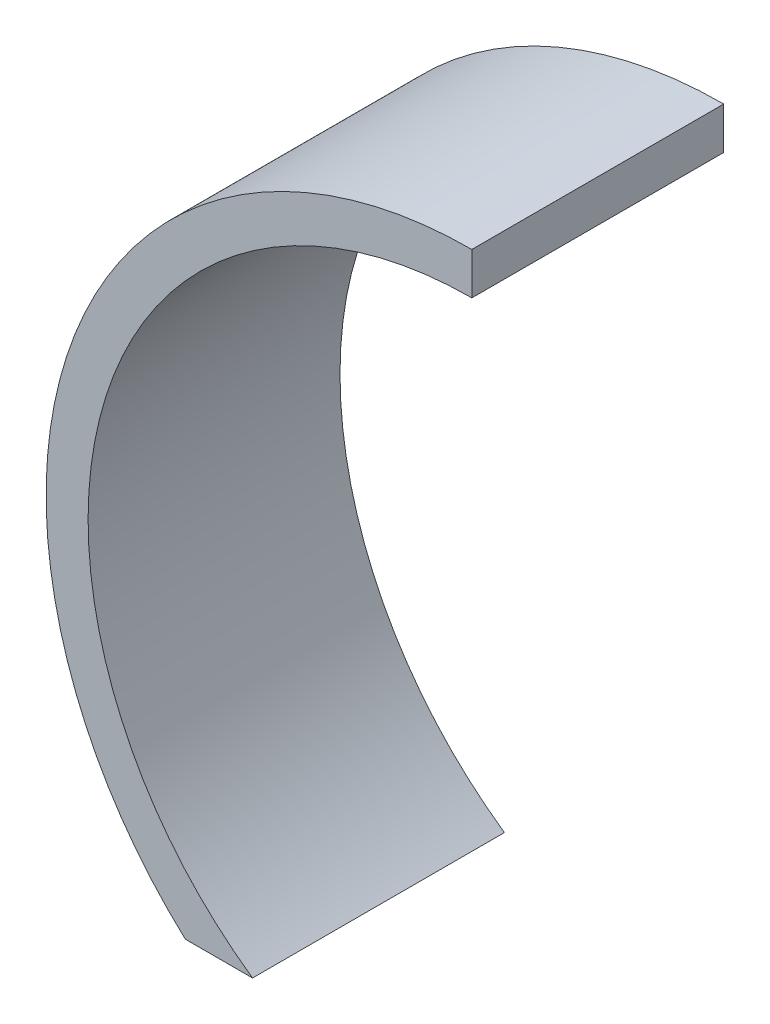
ISO-10303-21;
HEADER;
FILE_DESCRIPTION(('STEP AP214'),'2;1');
FILE_NAME('part.step','',(''),(''),'','','');
FILE_SCHEMA(('AUTOMOTIVE_DESIGN { 1 0 10303 214 1 1 1 1 }'));
ENDSEC;
DATA;
#1=APPLICATION_CONTEXT('core data for automotive mechanical design processes');
#2=APPLICATION_PROTOCOL_DEFINITION('international standard','automotive_design',2000,#1);
#3=PRODUCT_CONTEXT('',#1,'mechanical');
#4=PRODUCT('Part','Part','',(#3));
#5=PRODUCT_RELATED_PRODUCT_CATEGORY('part','',(#4));
#6=PRODUCT_DEFINITION_FORMATION('','',#4);
#7=PRODUCT_DEFINITION_CONTEXT('part definition',#1,'design');
#8=PRODUCT_DEFINITION('design','',#6,#7);
#9=PRODUCT_DEFINITION_SHAPE('','',#8);
#10=(LENGTH_UNIT() NAMED_UNIT(*) SI_UNIT(.MILLI.,.METRE.));
#11=(NAMED_UNIT(*) PLANE_ANGLE_UNIT() SI_UNIT($,.RADIAN.));
#12=(NAMED_UNIT(*) SI_UNIT($,.STERADIAN.) SOLID_ANGLE_UNIT());
#13=UNCERTAINTY_MEASURE_WITH_UNIT(LENGTH_MEASURE(1.E-05),#10,'distance_accuracy_value','');
#14=(GEOMETRIC_REPRESENTATION_CONTEXT(3) GLOBAL_UNCERTAINTY_ASSIGNED_CONTEXT((#13)) GLOBAL_UNIT_ASSIGNED_CONTEXT((#10,
#11,#12)) REPRESENTATION_CONTEXT('',''));
#15=CARTESIAN_POINT('',(0.,0.,0.));
#16=DIRECTION('',(0.,0.,1.));
#17=DIRECTION('',(1.,0.,0.));
#18=AXIS2_PLACEMENT_3D('',#15,#16,#17);
#19=CARTESIAN_POINT('',(0.,58.04,-171.847998429378));
#20=DIRECTION('',(1.,0.,0.));
#21=DIRECTION('',(0.,0.,-1.));
#22=AXIS2_PLACEMENT_3D('',#19,#20,#21);
#23=PLANE('',#22);
#24=DIRECTION('',(0.,-1.,0.));
#25=VECTOR('',#24,1.);
#26=CARTESIAN_POINT('',(0.,58.04,-38.1));
#27=LINE('',#26,#25);
#28=CARTESIAN_POINT('',(0.,64.39,-38.1));
#29=VERTEX_POINT('',#28);
#30=CARTESIAN_POINT('',(0.,58.04,-38.1));
#31=VERTEX_POINT('',#30);
#32=EDGE_CURVE('E44',#29,#31,#27,.T.);
#33=ORIENTED_EDGE('',*,*,#32,.F.);
#34=DIRECTION('',(0.,0.,1.));
#35=VECTOR('',#34,1.);
#36=CARTESIAN_POINT('',(0.,64.39,-171.847998429378));
#37=LINE('',#36,#35);
#38=CARTESIAN_POINT('',(0.,64.39,0.));
#39=VERTEX_POINT('',#38);
#40=EDGE_CURVE('E91',#29,#39,#37,.T.);
#41=ORIENTED_EDGE('',*,*,#40,.T.);
#42=DIRECTION('',(0.,1.,0.));
#43=VECTOR('',#42,1.);
#44=CARTESIAN_POINT('',(0.,58.04,0.));
#45=LINE('',#44,#43);
#46=CARTESIAN_POINT('',(0.,58.04,0.));
#47=VERTEX_POINT('',#46);
#48=EDGE_CURVE('E99',#47,#39,#45,.T.);
#49=ORIENTED_EDGE('',*,*,#48,.F.);
#50=DIRECTION('',(0.,0.,1.));
#51=VECTOR('',#50,1.);
#52=CARTESIAN_POINT('',(0.,58.04,-171.847998429378));
#53=LINE('',#52,#51);
#54=EDGE_CURVE('E85',#31,#47,#53,.T.);
#55=ORIENTED_EDGE('',*,*,#54,.F.);
#56=EDGE_LOOP('',(#33,#41,#49,#55));
#57=FACE_BOUND('',#56,.T.);
#58=ADVANCED_FACE('F37',(#57),#23,.T.);
#59=CARTESIAN_POINT('',(0.,0.,-171.847998429378));
#60=DIRECTION('',(0.,0.,1.));
#61=DIRECTION('',(1.,0.,0.));
#62=AXIS2_PLACEMENT_3D('',#59,#60,#61);
#63=CYLINDRICAL_SURFACE('',#62,58.04);
#64=DIRECTION('',(0.,0.,1.));
#65=VECTOR('',#64,1.);
#66=CARTESIAN_POINT('',(-33.1703123139027,-47.6274288724276,-171.847998429378));
#67=LINE('',#66,#65);
#68=CARTESIAN_POINT('',(-33.1703123139028,-47.6274288724276,-38.1));
#69=VERTEX_POINT('',#68);
#70=CARTESIAN_POINT('',(-33.1703123139028,-47.6274288724276,0.));
#71=VERTEX_POINT('',#70);
#72=EDGE_CURVE('E76',#69,#71,#67,.T.);
#73=ORIENTED_EDGE('',*,*,#72,.F.);
#74=CARTESIAN_POINT('',(0.,0.,-38.1));
#75=DIRECTION('',(0.,0.,1.));
#76=DIRECTION('',(1.,0.,0.));
#77=AXIS2_PLACEMENT_3D('',#74,#75,#76);
#78=CIRCLE('',#77,58.04);
#79=EDGE_CURVE('E81',#69,#31,#78,.F.);
#80=ORIENTED_EDGE('',*,*,#79,.T.);
#81=ORIENTED_EDGE('',*,*,#54,.T.);
#82=CARTESIAN_POINT('',(0.,0.,0.));
#83=DIRECTION('',(0.,0.,1.));
#84=DIRECTION('',(1.,0.,0.));
#85=AXIS2_PLACEMENT_3D('',#82,#83,#84);
#86=CIRCLE('',#85,58.04);
#87=EDGE_CURVE('E90',#47,#71,#86,.T.);
#88=ORIENTED_EDGE('',*,*,#87,.T.);
#89=EDGE_LOOP('',(#73,#80,#81,#88));
#90=FACE_BOUND('',#89,.T.);
#91=ADVANCED_FACE('F88',(#90),#63,.F.);
#92=CARTESIAN_POINT('',(0.,0.,-171.847998429378));
#93=DIRECTION('',(0.,0.,1.));
#94=DIRECTION('',(1.,0.,0.));
#95=AXIS2_PLACEMENT_3D('',#92,#93,#94);
#96=CYLINDRICAL_SURFACE('',#95,64.39);
#97=DIRECTION('',(0.,0.,1.));
#98=VECTOR('',#97,1.);
#99=CARTESIAN_POINT('',(-43.3324372612694,-47.6274288724276,-38.1));
#100=LINE('',#99,#98);
#101=CARTESIAN_POINT('',(-43.3324372612694,-47.6274288724276,-38.1));
#102=VERTEX_POINT('',#101);
#103=CARTESIAN_POINT('',(-43.3324372612694,-47.6274288724276,0.));
#104=VERTEX_POINT('',#103);
#105=EDGE_CURVE('E51',#102,#104,#100,.T.);
#106=ORIENTED_EDGE('',*,*,#105,.T.);
#107=CARTESIAN_POINT('',(0.,0.,0.));
#108=DIRECTION('',(0.,0.,1.));
#109=DIRECTION('',(1.,0.,0.));
#110=AXIS2_PLACEMENT_3D('',#107,#108,#109);
#111=CIRCLE('',#110,64.39);
#112=EDGE_CURVE('E96',#39,#104,#111,.T.);
#113=ORIENTED_EDGE('',*,*,#112,.F.);
#114=ORIENTED_EDGE('',*,*,#40,.F.);
#115=CARTESIAN_POINT('',(0.,0.,-38.1));
#116=DIRECTION('',(0.,0.,1.));
#117=DIRECTION('',(1.,0.,0.));
#118=AXIS2_PLACEMENT_3D('',#115,#116,#117);
#119=CIRCLE('',#118,64.39);
#120=EDGE_CURVE('E11',#102,#29,#119,.F.);
#121=ORIENTED_EDGE('',*,*,#120,.F.);
#122=EDGE_LOOP('',(#106,#113,#114,#121));
#123=FACE_BOUND('',#122,.T.);
#124=ADVANCED_FACE('F107',(#123),#96,.T.);
#125=CARTESIAN_POINT('',(0.,0.,0.));
#126=DIRECTION('',(0.,0.,1.));
#127=DIRECTION('',(1.,0.,0.));
#128=AXIS2_PLACEMENT_3D('',#125,#126,#127);
#129=PLANE('',#128);
#130=DIRECTION('',(-1.,0.,0.));
#131=VECTOR('',#130,1.);
#132=CARTESIAN_POINT('',(0.,-47.6274288724276,0.));
#133=LINE('',#132,#131);
#134=EDGE_CURVE('E79',#71,#104,#133,.T.);
#135=ORIENTED_EDGE('',*,*,#134,.F.);
#136=ORIENTED_EDGE('',*,*,#87,.F.);
#137=ORIENTED_EDGE('',*,*,#48,.T.);
#138=ORIENTED_EDGE('',*,*,#112,.T.);
#139=EDGE_LOOP('',(#135,#136,#137,#138));
#140=FACE_BOUND('',#139,.T.);
#141=ADVANCED_FACE('F109',(#140),#129,.T.);
#142=CARTESIAN_POINT('',(0.,0.,-38.1));
#143=DIRECTION('',(0.,0.,1.));
#144=DIRECTION('',(1.,0.,0.));
#145=AXIS2_PLACEMENT_3D('',#142,#143,#144);
#146=PLANE('',#145);
#147=ORIENTED_EDGE('',*,*,#79,.F.);
#148=DIRECTION('',(-1.,0.,0.));
#149=VECTOR('',#148,1.);
#150=CARTESIAN_POINT('',(0.,-47.6274288724276,-38.1));
#151=LINE('',#150,#149);
#152=EDGE_CURVE('E73',#69,#102,#151,.T.);
#153=ORIENTED_EDGE('',*,*,#152,.T.);
#154=ORIENTED_EDGE('',*,*,#120,.T.);
#155=ORIENTED_EDGE('',*,*,#32,.T.);
#156=EDGE_LOOP('',(#147,#153,#154,#155));
#157=FACE_BOUND('',#156,.T.);
#158=ADVANCED_FACE('F82',(#157),#146,.F.);
#159=CARTESIAN_POINT('',(0.,-47.6274288724276,-38.1));
#160=DIRECTION('',(0.,1.,0.));
#161=DIRECTION('',(0.,0.,1.));
#162=AXIS2_PLACEMENT_3D('',#159,#160,#161);
#163=PLANE('',#162);
#164=ORIENTED_EDGE('',*,*,#134,.T.);
#165=ORIENTED_EDGE('',*,*,#105,.F.);
#166=ORIENTED_EDGE('',*,*,#152,.F.);
#167=ORIENTED_EDGE('',*,*,#72,.T.);
#168=EDGE_LOOP('',(#164,#165,#166,#167));
#169=FACE_BOUND('',#168,.T.);
#170=ADVANCED_FACE('F74',(#169),#163,.F.);
#171=CLOSED_SHELL('',(#58,#91,#124,#141,#158,#170));
#172=MANIFOLD_SOLID_BREP('B2',#171);
#173=ADVANCED_BREP_SHAPE_REPRESENTATION('',(#18,#172),#14);
#174=SHAPE_DEFINITION_REPRESENTATION(#9,#173);
ENDSEC;
END-ISO-10303-21;
